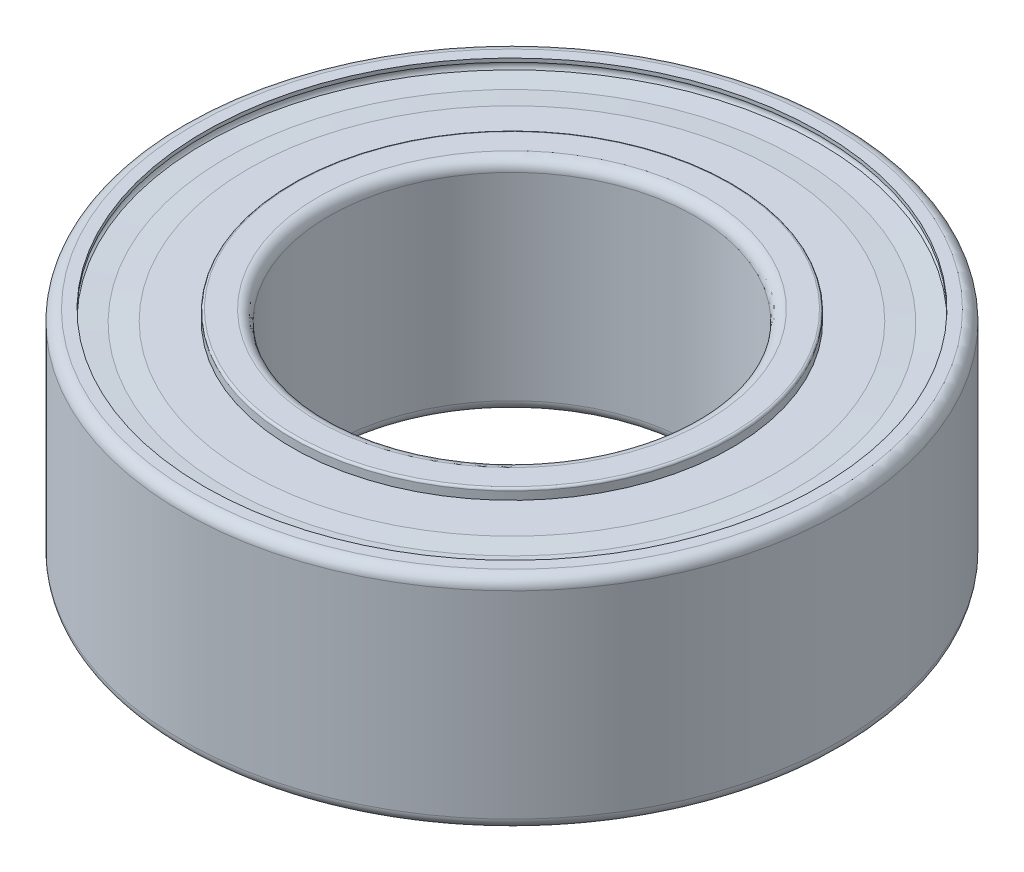
ISO-10303-21;
HEADER;
FILE_DESCRIPTION(('STEP AP214'),'2;1');
FILE_NAME('part.step','',(''),(''),'','','');
FILE_SCHEMA(('AUTOMOTIVE_DESIGN { 1 0 10303 214 1 1 1 1 }'));
ENDSEC;
DATA;
#1=APPLICATION_CONTEXT('core data for automotive mechanical design processes');
#2=APPLICATION_PROTOCOL_DEFINITION('international standard','automotive_design',2000,#1);
#3=PRODUCT_CONTEXT('',#1,'mechanical');
#4=PRODUCT('Part','Part','',(#3));
#5=PRODUCT_RELATED_PRODUCT_CATEGORY('part','',(#4));
#6=PRODUCT_DEFINITION_FORMATION('','',#4);
#7=PRODUCT_DEFINITION_CONTEXT('part definition',#1,'design');
#8=PRODUCT_DEFINITION('design','',#6,#7);
#9=PRODUCT_DEFINITION_SHAPE('','',#8);
#10=(LENGTH_UNIT() NAMED_UNIT(*) SI_UNIT(.MILLI.,.METRE.));
#11=(NAMED_UNIT(*) PLANE_ANGLE_UNIT() SI_UNIT($,.RADIAN.));
#12=(NAMED_UNIT(*) SI_UNIT($,.STERADIAN.) SOLID_ANGLE_UNIT());
#13=UNCERTAINTY_MEASURE_WITH_UNIT(LENGTH_MEASURE(1.E-05),#10,'distance_accuracy_value','');
#14=(GEOMETRIC_REPRESENTATION_CONTEXT(3) GLOBAL_UNCERTAINTY_ASSIGNED_CONTEXT((#13)) GLOBAL_UNIT_ASSIGNED_CONTEXT((#10,
#11,#12)) REPRESENTATION_CONTEXT('',''));
#15=CARTESIAN_POINT('',(0.,0.,0.));
#16=DIRECTION('',(0.,0.,1.));
#17=DIRECTION('',(1.,0.,0.));
#18=AXIS2_PLACEMENT_3D('',#15,#16,#17);
#19=CARTESIAN_POINT('',(2.43951839509362,0.,-2.43951839509356));
#20=DIRECTION('',(0.,1.,0.));
#21=DIRECTION('',(0.707106781186556,0.,-0.707106781186539));
#22=AXIS2_PLACEMENT_3D('',#19,#20,#21);
#23=SPHERICAL_SURFACE('',#22,0.6);
#24=CARTESIAN_POINT('',(2.43951839509362,0.599999999999998,-2.43951839509356));
#25=VERTEX_POINT('',#24);
#26=VERTEX_LOOP('',#25);
#27=FACE_BOUND('',#26,.T.);
#28=ADVANCED_FACE('F38',(#27),#23,.T.);
#29=CLOSED_SHELL('',(#28));
#30=MANIFOLD_SOLID_BREP('B2',#29);
#31=CARTESIAN_POINT('',(0.,0.,-3.45));
#32=DIRECTION('',(0.,1.,0.));
#33=DIRECTION('',(0.,0.,-1.));
#34=AXIS2_PLACEMENT_3D('',#31,#32,#33);
#35=SPHERICAL_SURFACE('',#34,0.6);
#36=CARTESIAN_POINT('',(0.,0.599999999999998,-3.45));
#37=VERTEX_POINT('',#36);
#38=VERTEX_LOOP('',#37);
#39=FACE_BOUND('',#38,.T.);
#40=ADVANCED_FACE('F69',(#39),#35,.T.);
#41=CLOSED_SHELL('',(#40));
#42=MANIFOLD_SOLID_BREP('B6',#41);
#43=CARTESIAN_POINT('',(-2.43951839509357,0.,-2.43951839509361));
#44=DIRECTION('',(0.,1.,0.));
#45=DIRECTION('',(-0.707106781186541,0.,-0.707106781186554));
#46=AXIS2_PLACEMENT_3D('',#43,#44,#45);
#47=SPHERICAL_SURFACE('',#46,0.6);
#48=CARTESIAN_POINT('',(-2.43951839509357,0.599999999999998,-2.43951839509361));
#49=VERTEX_POINT('',#48);
#50=VERTEX_LOOP('',#49);
#51=FACE_BOUND('',#50,.T.);
#52=ADVANCED_FACE('F100',(#51),#47,.T.);
#53=CLOSED_SHELL('',(#52));
#54=MANIFOLD_SOLID_BREP('B34',#53);
#55=CARTESIAN_POINT('',(-3.45,0.,0.));
#56=DIRECTION('',(0.,1.,0.));
#57=DIRECTION('',(-1.,0.,0.));
#58=AXIS2_PLACEMENT_3D('',#55,#56,#57);
#59=SPHERICAL_SURFACE('',#58,0.6);
#60=CARTESIAN_POINT('',(-3.45,0.599999999999998,0.));
#61=VERTEX_POINT('',#60);
#62=VERTEX_LOOP('',#61);
#63=FACE_BOUND('',#62,.T.);
#64=ADVANCED_FACE('F131',(#63),#59,.T.);
#65=CLOSED_SHELL('',(#64));
#66=MANIFOLD_SOLID_BREP('B65',#65);
#67=CARTESIAN_POINT('',(-2.4395183950936,0.,2.43951839509358));
#68=DIRECTION('',(0.,1.,0.));
#69=DIRECTION('',(-0.707106781186551,0.,0.707106781186544));
#70=AXIS2_PLACEMENT_3D('',#67,#68,#69);
#71=SPHERICAL_SURFACE('',#70,0.6);
#72=CARTESIAN_POINT('',(-2.4395183950936,0.599999999999998,2.43951839509358));
#73=VERTEX_POINT('',#72);
#74=VERTEX_LOOP('',#73);
#75=FACE_BOUND('',#74,.T.);
#76=ADVANCED_FACE('F162',(#75),#71,.T.);
#77=CLOSED_SHELL('',(#76));
#78=MANIFOLD_SOLID_BREP('B96',#77);
#79=CARTESIAN_POINT('',(0.,0.,3.45));
#80=DIRECTION('',(0.,1.,0.));
#81=DIRECTION('',(0.,0.,1.));
#82=AXIS2_PLACEMENT_3D('',#79,#80,#81);
#83=SPHERICAL_SURFACE('',#82,0.6);
#84=CARTESIAN_POINT('',(0.,0.599999999999998,3.45));
#85=VERTEX_POINT('',#84);
#86=VERTEX_LOOP('',#85);
#87=FACE_BOUND('',#86,.T.);
#88=ADVANCED_FACE('F193',(#87),#83,.T.);
#89=CLOSED_SHELL('',(#88));
#90=MANIFOLD_SOLID_BREP('B127',#89);
#91=CARTESIAN_POINT('',(2.43951839509359,0.,2.43951839509359));
#92=DIRECTION('',(0.,1.,0.));
#93=DIRECTION('',(0.707106781186546,0.,0.707106781186549));
#94=AXIS2_PLACEMENT_3D('',#91,#92,#93);
#95=SPHERICAL_SURFACE('',#94,0.6);
#96=CARTESIAN_POINT('',(2.43951839509359,0.599999999999998,2.43951839509359));
#97=VERTEX_POINT('',#96);
#98=VERTEX_LOOP('',#97);
#99=FACE_BOUND('',#98,.T.);
#100=ADVANCED_FACE('F224',(#99),#95,.T.);
#101=CLOSED_SHELL('',(#100));
#102=MANIFOLD_SOLID_BREP('B158',#101);
#103=CARTESIAN_POINT('',(3.45,0.,0.));
#104=DIRECTION('',(0.,1.,0.));
#105=DIRECTION('',(1.,0.,0.));
#106=AXIS2_PLACEMENT_3D('',#103,#104,#105);
#107=SPHERICAL_SURFACE('',#106,0.6);
#108=CARTESIAN_POINT('',(3.45,0.599999999999998,0.));
#109=VERTEX_POINT('',#108);
#110=VERTEX_LOOP('',#109);
#111=FACE_BOUND('',#110,.T.);
#112=ADVANCED_FACE('F257',(#111),#107,.T.);
#113=CLOSED_SHELL('',(#112));
#114=MANIFOLD_SOLID_BREP('B189',#113);
#115=CARTESIAN_POINT('',(3.9,1.27,0.));
#116=DIRECTION('',(0.,-1.,0.));
#117=DIRECTION('',(0.,0.,-1.));
#118=AXIS2_PLACEMENT_3D('',#115,#116,#117);
#119=PLANE('',#118);
#120=CARTESIAN_POINT('',(0.,1.27,0.));
#121=DIRECTION('',(0.,-1.,0.));
#122=DIRECTION('',(0.,0.,-1.));
#123=AXIS2_PLACEMENT_3D('',#120,#121,#122);
#124=CIRCLE('',#123,3.9);
#125=CARTESIAN_POINT('',(0.,1.27,-3.9));
#126=VERTEX_POINT('',#125);
#127=EDGE_CURVE('E256',#126,#126,#124,.T.);
#128=ORIENTED_EDGE('',*,*,#127,.T.);
#129=EDGE_LOOP('',(#128));
#130=FACE_BOUND('',#129,.T.);
#131=CARTESIAN_POINT('',(0.,1.27,0.));
#132=DIRECTION('',(0.,-1.,0.));
#133=DIRECTION('',(0.,0.,-1.));
#134=AXIS2_PLACEMENT_3D('',#131,#132,#133);
#135=CIRCLE('',#134,3.6);
#136=CARTESIAN_POINT('',(0.,1.27,-3.6));
#137=VERTEX_POINT('',#136);
#138=EDGE_CURVE('E359',#137,#137,#135,.T.);
#139=ORIENTED_EDGE('',*,*,#138,.F.);
#140=EDGE_LOOP('',(#139));
#141=FACE_BOUND('',#140,.T.);
#142=ADVANCED_FACE('F277',(#130,#141),#119,.T.);
#143=CARTESIAN_POINT('',(0.,1.27,0.));
#144=DIRECTION('',(0.,1.,0.));
#145=DIRECTION('',(0.,0.,1.));
#146=AXIS2_PLACEMENT_3D('',#143,#144,#145);
#147=CONICAL_SURFACE('',#146,3.9,1.43824479449822);
#148=CARTESIAN_POINT('',(0.,1.31,0.));
#149=DIRECTION('',(0.,-1.,0.));
#150=DIRECTION('',(0.,0.,-1.));
#151=AXIS2_PLACEMENT_3D('',#148,#149,#150);
#152=CIRCLE('',#151,4.2);
#153=CARTESIAN_POINT('',(0.,1.31,-4.2));
#154=VERTEX_POINT('',#153);
#155=EDGE_CURVE('E283',#154,#154,#152,.T.);
#156=ORIENTED_EDGE('',*,*,#155,.T.);
#157=EDGE_LOOP('',(#156));
#158=FACE_BOUND('',#157,.T.);
#159=ORIENTED_EDGE('',*,*,#127,.F.);
#160=EDGE_LOOP('',(#159));
#161=FACE_BOUND('',#160,.T.);
#162=ADVANCED_FACE('F367',(#158,#161),#147,.T.);
#163=CARTESIAN_POINT('',(0.,0.,0.));
#164=DIRECTION('',(0.,-1.,0.));
#165=DIRECTION('',(0.,0.,-1.));
#166=AXIS2_PLACEMENT_3D('',#163,#164,#165);
#167=CYLINDRICAL_SURFACE('',#166,4.2);
#168=CARTESIAN_POINT('',(0.,1.36,0.));
#169=DIRECTION('',(0.,-1.,0.));
#170=DIRECTION('',(0.,0.,-1.));
#171=AXIS2_PLACEMENT_3D('',#168,#169,#170);
#172=CIRCLE('',#171,4.2);
#173=CARTESIAN_POINT('',(0.,1.36,-4.2));
#174=VERTEX_POINT('',#173);
#175=EDGE_CURVE('E287',#174,#174,#172,.T.);
#176=ORIENTED_EDGE('',*,*,#175,.T.);
#177=EDGE_LOOP('',(#176));
#178=FACE_BOUND('',#177,.T.);
#179=ORIENTED_EDGE('',*,*,#155,.F.);
#180=EDGE_LOOP('',(#179));
#181=FACE_BOUND('',#180,.T.);
#182=ADVANCED_FACE('F371',(#178,#181),#167,.T.);
#183=CARTESIAN_POINT('',(0.,1.36,0.));
#184=DIRECTION('',(0.,1.,0.));
#185=DIRECTION('',(0.,0.,1.));
#186=AXIS2_PLACEMENT_3D('',#183,#184,#185);
#187=CONICAL_SURFACE('',#186,4.2,1.50422816301907);
#188=CARTESIAN_POINT('',(0.,1.34,0.));
#189=DIRECTION('',(0.,-1.,0.));
#190=DIRECTION('',(0.,0.,-1.));
#191=AXIS2_PLACEMENT_3D('',#188,#189,#190);
#192=CIRCLE('',#191,3.9);
#193=CARTESIAN_POINT('',(0.,1.34,-3.9));
#194=VERTEX_POINT('',#193);
#195=EDGE_CURVE('E291',#194,#194,#192,.T.);
#196=ORIENTED_EDGE('',*,*,#195,.T.);
#197=EDGE_LOOP('',(#196));
#198=FACE_BOUND('',#197,.T.);
#199=ORIENTED_EDGE('',*,*,#175,.F.);
#200=EDGE_LOOP('',(#199));
#201=FACE_BOUND('',#200,.T.);
#202=ADVANCED_FACE('F375',(#198,#201),#187,.F.);
#203=CARTESIAN_POINT('',(0.,1.34,0.));
#204=DIRECTION('',(0.,-1.,0.));
#205=DIRECTION('',(0.,0.,-1.));
#206=AXIS2_PLACEMENT_3D('',#203,#204,#205);
#207=CONICAL_SURFACE('',#206,3.9,1.50422816301907);
#208=CARTESIAN_POINT('',(0.,1.36,0.));
#209=DIRECTION('',(0.,-1.,0.));
#210=DIRECTION('',(0.,0.,-1.));
#211=AXIS2_PLACEMENT_3D('',#208,#209,#210);
#212=CIRCLE('',#211,3.6);
#213=CARTESIAN_POINT('',(0.,1.36,-3.6));
#214=VERTEX_POINT('',#213);
#215=EDGE_CURVE('E296',#214,#214,#212,.T.);
#216=ORIENTED_EDGE('',*,*,#215,.T.);
#217=EDGE_LOOP('',(#216));
#218=FACE_BOUND('',#217,.T.);
#219=ORIENTED_EDGE('',*,*,#195,.F.);
#220=EDGE_LOOP('',(#219));
#221=FACE_BOUND('',#220,.T.);
#222=ADVANCED_FACE('F382',(#218,#221),#207,.T.);
#223=CARTESIAN_POINT('',(3.,1.36,0.));
#224=DIRECTION('',(0.,1.,0.));
#225=DIRECTION('',(0.,0.,1.));
#226=AXIS2_PLACEMENT_3D('',#223,#224,#225);
#227=PLANE('',#226);
#228=CARTESIAN_POINT('',(0.,1.36,0.));
#229=DIRECTION('',(0.,-1.,0.));
#230=DIRECTION('',(0.,0.,-1.));
#231=AXIS2_PLACEMENT_3D('',#228,#229,#230);
#232=CIRCLE('',#231,3.);
#233=CARTESIAN_POINT('',(0.,1.36,-3.));
#234=VERTEX_POINT('',#233);
#235=EDGE_CURVE('E299',#234,#234,#232,.T.);
#236=ORIENTED_EDGE('',*,*,#235,.T.);
#237=EDGE_LOOP('',(#236));
#238=FACE_BOUND('',#237,.T.);
#239=ORIENTED_EDGE('',*,*,#215,.F.);
#240=EDGE_LOOP('',(#239));
#241=FACE_BOUND('',#240,.T.);
#242=ADVANCED_FACE('F386',(#238,#241),#227,.T.);
#243=CARTESIAN_POINT('',(0.,0.,0.));
#244=DIRECTION('',(0.,-1.,0.));
#245=DIRECTION('',(0.,0.,-1.));
#246=AXIS2_PLACEMENT_3D('',#243,#244,#245);
#247=CYLINDRICAL_SURFACE('',#246,3.);
#248=CARTESIAN_POINT('',(0.,1.47,0.));
#249=DIRECTION('',(0.,-1.,0.));
#250=DIRECTION('',(0.,0.,-1.));
#251=AXIS2_PLACEMENT_3D('',#248,#249,#250);
#252=CIRCLE('',#251,3.);
#253=CARTESIAN_POINT('',(0.,1.47,-3.));
#254=VERTEX_POINT('',#253);
#255=EDGE_CURVE('E302',#254,#254,#252,.T.);
#256=ORIENTED_EDGE('',*,*,#255,.T.);
#257=EDGE_LOOP('',(#256));
#258=FACE_BOUND('',#257,.T.);
#259=ORIENTED_EDGE('',*,*,#235,.F.);
#260=EDGE_LOOP('',(#259));
#261=FACE_BOUND('',#260,.T.);
#262=ADVANCED_FACE('F390',(#258,#261),#247,.T.);
#263=CARTESIAN_POINT('',(0.,1.47,0.));
#264=DIRECTION('',(0.,-1.,0.));
#265=DIRECTION('',(0.,0.,-1.));
#266=AXIS2_PLACEMENT_3D('',#263,#264,#265);
#267=TOROIDAL_SURFACE('',#266,2.97,0.0300000000000003);
#268=CARTESIAN_POINT('',(0.,1.5,0.));
#269=DIRECTION('',(0.,-1.,0.));
#270=DIRECTION('',(0.,0.,-1.));
#271=AXIS2_PLACEMENT_3D('',#268,#269,#270);
#272=CIRCLE('',#271,2.97);
#273=CARTESIAN_POINT('',(0.,1.5,-2.97));
#274=VERTEX_POINT('',#273);
#275=EDGE_CURVE('E305',#274,#274,#272,.T.);
#276=ORIENTED_EDGE('',*,*,#275,.T.);
#277=EDGE_LOOP('',(#276));
#278=FACE_BOUND('',#277,.T.);
#279=ORIENTED_EDGE('',*,*,#255,.F.);
#280=EDGE_LOOP('',(#279));
#281=FACE_BOUND('',#280,.T.);
#282=ADVANCED_FACE('F394',(#278,#281),#267,.T.);
#283=CARTESIAN_POINT('',(2.65,1.5,0.));
#284=DIRECTION('',(0.,1.,0.));
#285=DIRECTION('',(0.,0.,1.));
#286=AXIS2_PLACEMENT_3D('',#283,#284,#285);
#287=PLANE('',#286);
#288=CARTESIAN_POINT('',(0.,1.5,0.));
#289=DIRECTION('',(0.,-1.,0.));
#290=DIRECTION('',(0.,0.,-1.));
#291=AXIS2_PLACEMENT_3D('',#288,#289,#290);
#292=CIRCLE('',#291,2.65);
#293=CARTESIAN_POINT('',(0.,1.5,-2.65));
#294=VERTEX_POINT('',#293);
#295=EDGE_CURVE('E308',#294,#294,#292,.T.);
#296=ORIENTED_EDGE('',*,*,#295,.T.);
#297=EDGE_LOOP('',(#296));
#298=FACE_BOUND('',#297,.T.);
#299=ORIENTED_EDGE('',*,*,#275,.F.);
#300=EDGE_LOOP('',(#299));
#301=FACE_BOUND('',#300,.T.);
#302=ADVANCED_FACE('F398',(#298,#301),#287,.T.);
#303=CARTESIAN_POINT('',(0.,1.35,0.));
#304=DIRECTION('',(0.,-1.,0.));
#305=DIRECTION('',(0.,0.,-1.));
#306=AXIS2_PLACEMENT_3D('',#303,#304,#305);
#307=TOROIDAL_SURFACE('',#306,2.65,0.15);
#308=CARTESIAN_POINT('',(0.,1.35,0.));
#309=DIRECTION('',(0.,-1.,0.));
#310=DIRECTION('',(0.,0.,-1.));
#311=AXIS2_PLACEMENT_3D('',#308,#309,#310);
#312=CIRCLE('',#311,2.5);
#313=CARTESIAN_POINT('',(0.,1.35,-2.5));
#314=VERTEX_POINT('',#313);
#315=EDGE_CURVE('E311',#314,#314,#312,.T.);
#316=ORIENTED_EDGE('',*,*,#315,.T.);
#317=EDGE_LOOP('',(#316));
#318=FACE_BOUND('',#317,.T.);
#319=ORIENTED_EDGE('',*,*,#295,.F.);
#320=EDGE_LOOP('',(#319));
#321=FACE_BOUND('',#320,.T.);
#322=ADVANCED_FACE('F402',(#318,#321),#307,.T.);
#323=CARTESIAN_POINT('',(0.,0.,0.));
#324=DIRECTION('',(0.,-1.,0.));
#325=DIRECTION('',(0.,0.,-1.));
#326=AXIS2_PLACEMENT_3D('',#323,#324,#325);
#327=CYLINDRICAL_SURFACE('',#326,2.5);
#328=CARTESIAN_POINT('',(0.,-1.35,0.));
#329=DIRECTION('',(0.,-1.,0.));
#330=DIRECTION('',(0.,0.,-1.));
#331=AXIS2_PLACEMENT_3D('',#328,#329,#330);
#332=CIRCLE('',#331,2.5);
#333=CARTESIAN_POINT('',(0.,-1.35,-2.5));
#334=VERTEX_POINT('',#333);
#335=EDGE_CURVE('E314',#334,#334,#332,.T.);
#336=ORIENTED_EDGE('',*,*,#335,.T.);
#337=EDGE_LOOP('',(#336));
#338=FACE_BOUND('',#337,.T.);
#339=ORIENTED_EDGE('',*,*,#315,.F.);
#340=EDGE_LOOP('',(#339));
#341=FACE_BOUND('',#340,.T.);
#342=ADVANCED_FACE('F406',(#338,#341),#327,.F.);
#343=CARTESIAN_POINT('',(0.,-1.35,0.));
#344=DIRECTION('',(0.,-1.,0.));
#345=DIRECTION('',(0.,0.,-1.));
#346=AXIS2_PLACEMENT_3D('',#343,#344,#345);
#347=TOROIDAL_SURFACE('',#346,2.65,0.15);
#348=CARTESIAN_POINT('',(0.,-1.5,0.));
#349=DIRECTION('',(0.,-1.,0.));
#350=DIRECTION('',(0.,0.,-1.));
#351=AXIS2_PLACEMENT_3D('',#348,#349,#350);
#352=CIRCLE('',#351,2.65);
#353=CARTESIAN_POINT('',(0.,-1.5,-2.65));
#354=VERTEX_POINT('',#353);
#355=EDGE_CURVE('E317',#354,#354,#352,.T.);
#356=ORIENTED_EDGE('',*,*,#355,.T.);
#357=EDGE_LOOP('',(#356));
#358=FACE_BOUND('',#357,.T.);
#359=ORIENTED_EDGE('',*,*,#335,.F.);
#360=EDGE_LOOP('',(#359));
#361=FACE_BOUND('',#360,.T.);
#362=ADVANCED_FACE('F410',(#358,#361),#347,.T.);
#363=CARTESIAN_POINT('',(2.65,-1.5,0.));
#364=DIRECTION('',(0.,-1.,0.));
#365=DIRECTION('',(0.,0.,-1.));
#366=AXIS2_PLACEMENT_3D('',#363,#364,#365);
#367=PLANE('',#366);
#368=CARTESIAN_POINT('',(0.,-1.5,0.));
#369=DIRECTION('',(0.,-1.,0.));
#370=DIRECTION('',(0.,0.,-1.));
#371=AXIS2_PLACEMENT_3D('',#368,#369,#370);
#372=CIRCLE('',#371,2.97);
#373=CARTESIAN_POINT('',(0.,-1.5,-2.97));
#374=VERTEX_POINT('',#373);
#375=EDGE_CURVE('E320',#374,#374,#372,.T.);
#376=ORIENTED_EDGE('',*,*,#375,.T.);
#377=EDGE_LOOP('',(#376));
#378=FACE_BOUND('',#377,.T.);
#379=ORIENTED_EDGE('',*,*,#355,.F.);
#380=EDGE_LOOP('',(#379));
#381=FACE_BOUND('',#380,.T.);
#382=ADVANCED_FACE('F414',(#378,#381),#367,.T.);
#383=CARTESIAN_POINT('',(0.,-1.47,0.));
#384=DIRECTION('',(0.,-1.,0.));
#385=DIRECTION('',(0.,0.,-1.));
#386=AXIS2_PLACEMENT_3D('',#383,#384,#385);
#387=TOROIDAL_SURFACE('',#386,2.97,0.0299999999999986);
#388=CARTESIAN_POINT('',(0.,-1.47,0.));
#389=DIRECTION('',(0.,-1.,0.));
#390=DIRECTION('',(0.,0.,-1.));
#391=AXIS2_PLACEMENT_3D('',#388,#389,#390);
#392=CIRCLE('',#391,3.);
#393=CARTESIAN_POINT('',(0.,-1.47,-3.));
#394=VERTEX_POINT('',#393);
#395=EDGE_CURVE('E323',#394,#394,#392,.T.);
#396=ORIENTED_EDGE('',*,*,#395,.T.);
#397=EDGE_LOOP('',(#396));
#398=FACE_BOUND('',#397,.T.);
#399=ORIENTED_EDGE('',*,*,#375,.F.);
#400=EDGE_LOOP('',(#399));
#401=FACE_BOUND('',#400,.T.);
#402=ADVANCED_FACE('F418',(#398,#401),#387,.T.);
#403=CARTESIAN_POINT('',(0.,0.,0.));
#404=DIRECTION('',(0.,-1.,0.));
#405=DIRECTION('',(0.,0.,-1.));
#406=AXIS2_PLACEMENT_3D('',#403,#404,#405);
#407=CYLINDRICAL_SURFACE('',#406,3.);
#408=CARTESIAN_POINT('',(0.,-1.36,0.));
#409=DIRECTION('',(0.,-1.,0.));
#410=DIRECTION('',(0.,0.,-1.));
#411=AXIS2_PLACEMENT_3D('',#408,#409,#410);
#412=CIRCLE('',#411,3.);
#413=CARTESIAN_POINT('',(0.,-1.36,-3.));
#414=VERTEX_POINT('',#413);
#415=EDGE_CURVE('E326',#414,#414,#412,.T.);
#416=ORIENTED_EDGE('',*,*,#415,.T.);
#417=EDGE_LOOP('',(#416));
#418=FACE_BOUND('',#417,.T.);
#419=ORIENTED_EDGE('',*,*,#395,.F.);
#420=EDGE_LOOP('',(#419));
#421=FACE_BOUND('',#420,.T.);
#422=ADVANCED_FACE('F422',(#418,#421),#407,.T.);
#423=CARTESIAN_POINT('',(3.,-1.36,0.));
#424=DIRECTION('',(0.,-1.,0.));
#425=DIRECTION('',(0.,0.,-1.));
#426=AXIS2_PLACEMENT_3D('',#423,#424,#425);
#427=PLANE('',#426);
#428=CARTESIAN_POINT('',(0.,-1.36,0.));
#429=DIRECTION('',(0.,-1.,0.));
#430=DIRECTION('',(0.,0.,-1.));
#431=AXIS2_PLACEMENT_3D('',#428,#429,#430);
#432=CIRCLE('',#431,3.6);
#433=CARTESIAN_POINT('',(0.,-1.36,-3.6));
#434=VERTEX_POINT('',#433);
#435=EDGE_CURVE('E329',#434,#434,#432,.T.);
#436=ORIENTED_EDGE('',*,*,#435,.T.);
#437=EDGE_LOOP('',(#436));
#438=FACE_BOUND('',#437,.T.);
#439=ORIENTED_EDGE('',*,*,#415,.F.);
#440=EDGE_LOOP('',(#439));
#441=FACE_BOUND('',#440,.T.);
#442=ADVANCED_FACE('F426',(#438,#441),#427,.T.);
#443=CARTESIAN_POINT('',(0.,-1.36,0.));
#444=DIRECTION('',(0.,1.,0.));
#445=DIRECTION('',(0.,0.,1.));
#446=AXIS2_PLACEMENT_3D('',#443,#444,#445);
#447=CONICAL_SURFACE('',#446,3.6,1.39793572000776);
#448=CARTESIAN_POINT('',(0.,-1.30828515273278,0.));
#449=DIRECTION('',(0.,-1.,0.));
#450=DIRECTION('',(0.,0.,-1.));
#451=AXIS2_PLACEMENT_3D('',#448,#449,#450);
#452=CIRCLE('',#451,3.89618503434868);
#453=CARTESIAN_POINT('',(0.,-1.30828515273278,-3.89618503434868));
#454=VERTEX_POINT('',#453);
#455=EDGE_CURVE('E332',#454,#454,#452,.T.);
#456=ORIENTED_EDGE('',*,*,#455,.T.);
#457=EDGE_LOOP('',(#456));
#458=FACE_BOUND('',#457,.T.);
#459=ORIENTED_EDGE('',*,*,#435,.F.);
#460=EDGE_LOOP('',(#459));
#461=FACE_BOUND('',#460,.T.);
#462=ADVANCED_FACE('F430',(#458,#461),#447,.T.);
#463=CARTESIAN_POINT('',(0.,-1.30828515273278,0.));
#464=DIRECTION('',(0.,-1.,0.));
#465=DIRECTION('',(0.,0.,-1.));
#466=AXIS2_PLACEMENT_3D('',#463,#464,#465);
#467=CONICAL_SURFACE('',#466,3.89618503434868,1.39793572000775);
#468=CARTESIAN_POINT('',(0.,-1.36,0.));
#469=DIRECTION('',(0.,-1.,0.));
#470=DIRECTION('',(0.,0.,-1.));
#471=AXIS2_PLACEMENT_3D('',#468,#469,#470);
#472=CIRCLE('',#471,4.19237006869736);
#473=CARTESIAN_POINT('',(0.,-1.36,-4.19237006869736));
#474=VERTEX_POINT('',#473);
#475=EDGE_CURVE('E335',#474,#474,#472,.T.);
#476=ORIENTED_EDGE('',*,*,#475,.T.);
#477=EDGE_LOOP('',(#476));
#478=FACE_BOUND('',#477,.T.);
#479=ORIENTED_EDGE('',*,*,#455,.F.);
#480=EDGE_LOOP('',(#479));
#481=FACE_BOUND('',#480,.T.);
#482=ADVANCED_FACE('F434',(#478,#481),#467,.F.);
#483=CARTESIAN_POINT('',(0.,0.,0.));
#484=DIRECTION('',(0.,-1.,0.));
#485=DIRECTION('',(0.,0.,-1.));
#486=AXIS2_PLACEMENT_3D('',#483,#484,#485);
#487=CYLINDRICAL_SURFACE('',#486,4.19237006869736);
#488=CARTESIAN_POINT('',(0.,-1.31,0.));
#489=DIRECTION('',(0.,-1.,0.));
#490=DIRECTION('',(0.,0.,-1.));
#491=AXIS2_PLACEMENT_3D('',#488,#489,#490);
#492=CIRCLE('',#491,4.19237006869736);
#493=CARTESIAN_POINT('',(0.,-1.31,-4.19237006869736));
#494=VERTEX_POINT('',#493);
#495=EDGE_CURVE('E338',#494,#494,#492,.T.);
#496=ORIENTED_EDGE('',*,*,#495,.T.);
#497=EDGE_LOOP('',(#496));
#498=FACE_BOUND('',#497,.T.);
#499=ORIENTED_EDGE('',*,*,#475,.F.);
#500=EDGE_LOOP('',(#499));
#501=FACE_BOUND('',#500,.T.);
#502=ADVANCED_FACE('F438',(#498,#501),#487,.T.);
#503=CARTESIAN_POINT('',(0.,-1.31,0.));
#504=DIRECTION('',(0.,-1.,0.));
#505=DIRECTION('',(0.,0.,-1.));
#506=AXIS2_PLACEMENT_3D('',#503,#504,#505);
#507=CONICAL_SURFACE('',#506,4.19237006869736,1.34397129289869);
#508=CARTESIAN_POINT('',(0.,-1.24193744191795,0.));
#509=DIRECTION('',(0.,-1.,0.));
#510=DIRECTION('',(0.,0.,-1.));
#511=AXIS2_PLACEMENT_3D('',#508,#509,#510);
#512=CIRCLE('',#511,3.89746756245618);
#513=CARTESIAN_POINT('',(0.,-1.24193744191795,-3.89746756245618));
#514=VERTEX_POINT('',#513);
#515=EDGE_CURVE('E341',#514,#514,#512,.T.);
#516=ORIENTED_EDGE('',*,*,#515,.T.);
#517=EDGE_LOOP('',(#516));
#518=FACE_BOUND('',#517,.T.);
#519=ORIENTED_EDGE('',*,*,#495,.F.);
#520=EDGE_LOOP('',(#519));
#521=FACE_BOUND('',#520,.T.);
#522=ADVANCED_FACE('F442',(#518,#521),#507,.T.);
#523=CARTESIAN_POINT('',(3.89746756245618,-1.24193744191795,0.));
#524=DIRECTION('',(0.,1.,0.));
#525=DIRECTION('',(0.,0.,1.));
#526=AXIS2_PLACEMENT_3D('',#523,#524,#525);
#527=PLANE('',#526);
#528=CARTESIAN_POINT('',(0.,-1.24193744191795,0.));
#529=DIRECTION('',(0.,-1.,0.));
#530=DIRECTION('',(0.,0.,-1.));
#531=AXIS2_PLACEMENT_3D('',#528,#529,#530);
#532=CIRCLE('',#531,3.59746756245618);
#533=CARTESIAN_POINT('',(0.,-1.24193744191795,-3.59746756245618));
#534=VERTEX_POINT('',#533);
#535=EDGE_CURVE('E344',#534,#534,#532,.T.);
#536=ORIENTED_EDGE('',*,*,#535,.T.);
#537=EDGE_LOOP('',(#536));
#538=FACE_BOUND('',#537,.T.);
#539=ORIENTED_EDGE('',*,*,#515,.F.);
#540=EDGE_LOOP('',(#539));
#541=FACE_BOUND('',#540,.T.);
#542=ADVANCED_FACE('F446',(#538,#541),#527,.T.);
#543=CARTESIAN_POINT('',(0.,-1.24193744191795,0.));
#544=DIRECTION('',(0.,1.,0.));
#545=DIRECTION('',(0.,0.,1.));
#546=AXIS2_PLACEMENT_3D('',#543,#544,#545);
#547=CONICAL_SURFACE('',#546,3.59746756245618,1.45736689783465);
#548=CARTESIAN_POINT('',(0.,-1.31,0.));
#549=DIRECTION('',(0.,-1.,0.));
#550=DIRECTION('',(0.,0.,-1.));
#551=AXIS2_PLACEMENT_3D('',#548,#549,#550);
#552=CIRCLE('',#551,3.);
#553=CARTESIAN_POINT('',(0.,-1.31,-3.));
#554=VERTEX_POINT('',#553);
#555=EDGE_CURVE('E347',#554,#554,#552,.T.);
#556=ORIENTED_EDGE('',*,*,#555,.T.);
#557=EDGE_LOOP('',(#556));
#558=FACE_BOUND('',#557,.T.);
#559=ORIENTED_EDGE('',*,*,#535,.F.);
#560=EDGE_LOOP('',(#559));
#561=FACE_BOUND('',#560,.T.);
#562=ADVANCED_FACE('F450',(#558,#561),#547,.F.);
#563=CARTESIAN_POINT('',(0.,0.,0.));
#564=DIRECTION('',(0.,-1.,0.));
#565=DIRECTION('',(0.,0.,-1.));
#566=AXIS2_PLACEMENT_3D('',#563,#564,#565);
#567=CYLINDRICAL_SURFACE('',#566,3.);
#568=CARTESIAN_POINT('',(0.,-0.396862696659691,0.));
#569=DIRECTION('',(0.,-1.,0.));
#570=DIRECTION('',(0.,0.,-1.));
#571=AXIS2_PLACEMENT_3D('',#568,#569,#570);
#572=CIRCLE('',#571,3.);
#573=CARTESIAN_POINT('',(0.,-0.396862696659691,-3.));
#574=VERTEX_POINT('',#573);
#575=EDGE_CURVE('E350',#574,#574,#572,.T.);
#576=ORIENTED_EDGE('',*,*,#575,.T.);
#577=EDGE_LOOP('',(#576));
#578=FACE_BOUND('',#577,.T.);
#579=ORIENTED_EDGE('',*,*,#555,.F.);
#580=EDGE_LOOP('',(#579));
#581=FACE_BOUND('',#580,.T.);
#582=ADVANCED_FACE('F454',(#578,#581),#567,.T.);
#583=CARTESIAN_POINT('',(0.,0.,0.));
#584=DIRECTION('',(0.,-1.,0.));
#585=DIRECTION('',(0.,0.,-1.));
#586=AXIS2_PLACEMENT_3D('',#583,#584,#585);
#587=TOROIDAL_SURFACE('',#586,3.45,0.6);
#588=CARTESIAN_POINT('',(0.,0.396862696659687,0.));
#589=DIRECTION('',(0.,-1.,0.));
#590=DIRECTION('',(0.,0.,-1.));
#591=AXIS2_PLACEMENT_3D('',#588,#589,#590);
#592=CIRCLE('',#591,3.);
#593=CARTESIAN_POINT('',(0.,0.396862696659687,-3.));
#594=VERTEX_POINT('',#593);
#595=EDGE_CURVE('E353',#594,#594,#592,.T.);
#596=ORIENTED_EDGE('',*,*,#595,.T.);
#597=EDGE_LOOP('',(#596));
#598=FACE_BOUND('',#597,.T.);
#599=ORIENTED_EDGE('',*,*,#575,.F.);
#600=EDGE_LOOP('',(#599));
#601=FACE_BOUND('',#600,.T.);
#602=ADVANCED_FACE('F458',(#598,#601),#587,.F.);
#603=CARTESIAN_POINT('',(0.,0.,0.));
#604=DIRECTION('',(0.,-1.,0.));
#605=DIRECTION('',(0.,0.,-1.));
#606=AXIS2_PLACEMENT_3D('',#603,#604,#605);
#607=CYLINDRICAL_SURFACE('',#606,3.);
#608=CARTESIAN_POINT('',(0.,1.31,0.));
#609=DIRECTION('',(0.,-1.,0.));
#610=DIRECTION('',(0.,0.,-1.));
#611=AXIS2_PLACEMENT_3D('',#608,#609,#610);
#612=CIRCLE('',#611,3.);
#613=CARTESIAN_POINT('',(0.,1.31,-3.));
#614=VERTEX_POINT('',#613);
#615=EDGE_CURVE('E356',#614,#614,#612,.T.);
#616=ORIENTED_EDGE('',*,*,#615,.T.);
#617=EDGE_LOOP('',(#616));
#618=FACE_BOUND('',#617,.T.);
#619=ORIENTED_EDGE('',*,*,#595,.F.);
#620=EDGE_LOOP('',(#619));
#621=FACE_BOUND('',#620,.T.);
#622=ADVANCED_FACE('F462',(#618,#621),#607,.T.);
#623=CARTESIAN_POINT('',(0.,1.31,0.));
#624=DIRECTION('',(0.,-1.,0.));
#625=DIRECTION('',(0.,0.,-1.));
#626=AXIS2_PLACEMENT_3D('',#623,#624,#625);
#627=CONICAL_SURFACE('',#626,3.,1.50422816301907);
#628=ORIENTED_EDGE('',*,*,#138,.T.);
#629=EDGE_LOOP('',(#628));
#630=FACE_BOUND('',#629,.T.);
#631=ORIENTED_EDGE('',*,*,#615,.F.);
#632=EDGE_LOOP('',(#631));
#633=FACE_BOUND('',#632,.T.);
#634=ADVANCED_FACE('F363',(#630,#633),#627,.F.);
#635=CLOSED_SHELL('',(#142,#162,#182,#202,#222,#242,#262,#282,#302,#322,#342,#362,#382,#402,
#422,#442,#462,#482,#502,#522,#542,#562,#582,#602,#622,#634));
#636=MANIFOLD_SOLID_BREP('B220',#635);
#637=CARTESIAN_POINT('',(0.,0.,0.));
#638=DIRECTION('',(0.,-1.,0.));
#639=DIRECTION('',(0.,0.,-1.));
#640=AXIS2_PLACEMENT_3D('',#637,#638,#639);
#641=CYLINDRICAL_SURFACE('',#640,3.85);
#642=CARTESIAN_POINT('',(0.,-1.21721359549996,0.));
#643=DIRECTION('',(0.,-1.,0.));
#644=DIRECTION('',(0.,0.,-1.));
#645=AXIS2_PLACEMENT_3D('',#642,#643,#644);
#646=CIRCLE('',#645,3.85);
#647=CARTESIAN_POINT('',(0.,-1.21721359549996,-3.85));
#648=VERTEX_POINT('',#647);
#649=EDGE_CURVE('E715',#648,#648,#646,.T.);
#650=ORIENTED_EDGE('',*,*,#649,.T.);
#651=EDGE_LOOP('',(#650));
#652=FACE_BOUND('',#651,.T.);
#653=CARTESIAN_POINT('',(0.,-0.447213595499958,0.));
#654=DIRECTION('',(0.,-1.,0.));
#655=DIRECTION('',(0.,0.,-1.));
#656=AXIS2_PLACEMENT_3D('',#653,#654,#655);
#657=CIRCLE('',#656,3.85);
#658=CARTESIAN_POINT('',(0.,-0.447213595499958,-3.85));
#659=VERTEX_POINT('',#658);
#660=EDGE_CURVE('E276',#659,#659,#657,.T.);
#661=ORIENTED_EDGE('',*,*,#660,.F.);
#662=EDGE_LOOP('',(#661));
#663=FACE_BOUND('',#662,.T.);
#664=ADVANCED_FACE('F669',(#652,#663),#641,.F.);
#665=CARTESIAN_POINT('',(0.,0.,0.));
#666=DIRECTION('',(0.,-1.,0.));
#667=DIRECTION('',(0.,0.,-1.));
#668=AXIS2_PLACEMENT_3D('',#665,#666,#667);
#669=TOROIDAL_SURFACE('',#668,3.45,0.6);
#670=ORIENTED_EDGE('',*,*,#660,.T.);
#671=EDGE_LOOP('',(#670));
#672=FACE_BOUND('',#671,.T.);
#673=CARTESIAN_POINT('',(0.,0.447213595499955,0.));
#674=DIRECTION('',(0.,-1.,0.));
#675=DIRECTION('',(0.,0.,-1.));
#676=AXIS2_PLACEMENT_3D('',#673,#674,#675);
#677=CIRCLE('',#676,3.85);
#678=CARTESIAN_POINT('',(0.,0.447213595499955,-3.85));
#679=VERTEX_POINT('',#678);
#680=EDGE_CURVE('E675',#679,#679,#677,.T.);
#681=ORIENTED_EDGE('',*,*,#680,.F.);
#682=EDGE_LOOP('',(#681));
#683=FACE_BOUND('',#682,.T.);
#684=ADVANCED_FACE('F733',(#672,#683),#669,.F.);
#685=CARTESIAN_POINT('',(0.,0.,0.));
#686=DIRECTION('',(0.,-1.,0.));
#687=DIRECTION('',(0.,0.,-1.));
#688=AXIS2_PLACEMENT_3D('',#685,#686,#687);
#689=CYLINDRICAL_SURFACE('',#688,3.85);
#690=ORIENTED_EDGE('',*,*,#680,.T.);
#691=EDGE_LOOP('',(#690));
#692=FACE_BOUND('',#691,.T.);
#693=CARTESIAN_POINT('',(0.,1.21721359549995,0.));
#694=DIRECTION('',(0.,-1.,0.));
#695=DIRECTION('',(0.,0.,-1.));
#696=AXIS2_PLACEMENT_3D('',#693,#694,#695);
#697=CIRCLE('',#696,3.85);
#698=CARTESIAN_POINT('',(0.,1.21721359549995,-3.85));
#699=VERTEX_POINT('',#698);
#700=EDGE_CURVE('E679',#699,#699,#697,.T.);
#701=ORIENTED_EDGE('',*,*,#700,.F.);
#702=EDGE_LOOP('',(#701));
#703=FACE_BOUND('',#702,.T.);
#704=ADVANCED_FACE('F737',(#692,#703),#689,.F.);
#705=CARTESIAN_POINT('',(0.,1.27096999256116,0.));
#706=DIRECTION('',(0.,1.,0.));
#707=DIRECTION('',(0.,0.,1.));
#708=AXIS2_PLACEMENT_3D('',#705,#706,#707);
#709=CONICAL_SURFACE('',#708,4.21317792758515,1.42384660244088);
#710=ORIENTED_EDGE('',*,*,#700,.T.);
#711=EDGE_LOOP('',(#710));
#712=FACE_BOUND('',#711,.T.);
#713=CARTESIAN_POINT('',(0.,1.27096999256116,0.));
#714=DIRECTION('',(0.,-1.,0.));
#715=DIRECTION('',(0.,0.,-1.));
#716=AXIS2_PLACEMENT_3D('',#713,#714,#715);
#717=CIRCLE('',#716,4.21317792758515);
#718=CARTESIAN_POINT('',(0.,1.27096999256116,-4.21317792758515));
#719=VERTEX_POINT('',#718);
#720=EDGE_CURVE('E683',#719,#719,#717,.T.);
#721=ORIENTED_EDGE('',*,*,#720,.F.);
#722=EDGE_LOOP('',(#721));
#723=FACE_BOUND('',#722,.T.);
#724=ADVANCED_FACE('F741',(#712,#723),#709,.F.);
#725=CARTESIAN_POINT('',(0.,1.36,0.));
#726=DIRECTION('',(0.,-1.,0.));
#727=DIRECTION('',(0.,0.,-1.));
#728=AXIS2_PLACEMENT_3D('',#725,#726,#727);
#729=TOROIDAL_SURFACE('',#728,4.2,0.09);
#730=ORIENTED_EDGE('',*,*,#720,.T.);
#731=EDGE_LOOP('',(#730));
#732=FACE_BOUND('',#731,.T.);
#733=CARTESIAN_POINT('',(0.,1.45,0.));
#734=DIRECTION('',(0.,-1.,0.));
#735=DIRECTION('',(0.,0.,-1.));
#736=AXIS2_PLACEMENT_3D('',#733,#734,#735);
#737=CIRCLE('',#736,4.2);
#738=CARTESIAN_POINT('',(0.,1.45,-4.2));
#739=VERTEX_POINT('',#738);
#740=EDGE_CURVE('E688',#739,#739,#737,.T.);
#741=ORIENTED_EDGE('',*,*,#740,.F.);
#742=EDGE_LOOP('',(#741));
#743=FACE_BOUND('',#742,.T.);
#744=ADVANCED_FACE('F747',(#732,#743),#729,.F.);
#745=CARTESIAN_POINT('',(0.,0.,0.));
#746=DIRECTION('',(0.,-1.,0.));
#747=DIRECTION('',(0.,0.,-1.));
#748=AXIS2_PLACEMENT_3D('',#745,#746,#747);
#749=CYLINDRICAL_SURFACE('',#748,4.2);
#750=ORIENTED_EDGE('',*,*,#740,.T.);
#751=EDGE_LOOP('',(#750));
#752=FACE_BOUND('',#751,.T.);
#753=CARTESIAN_POINT('',(0.,1.5,0.));
#754=DIRECTION('',(0.,-1.,0.));
#755=DIRECTION('',(0.,0.,-1.));
#756=AXIS2_PLACEMENT_3D('',#753,#754,#755);
#757=CIRCLE('',#756,4.2);
#758=CARTESIAN_POINT('',(0.,1.5,-4.2));
#759=VERTEX_POINT('',#758);
#760=EDGE_CURVE('E691',#759,#759,#757,.T.);
#761=ORIENTED_EDGE('',*,*,#760,.F.);
#762=EDGE_LOOP('',(#761));
#763=FACE_BOUND('',#762,.T.);
#764=ADVANCED_FACE('F751',(#752,#763),#749,.F.);
#765=CARTESIAN_POINT('',(4.35,1.5,0.));
#766=DIRECTION('',(0.,1.,0.));
#767=DIRECTION('',(0.,0.,1.));
#768=AXIS2_PLACEMENT_3D('',#765,#766,#767);
#769=PLANE('',#768);
#770=ORIENTED_EDGE('',*,*,#760,.T.);
#771=EDGE_LOOP('',(#770));
#772=FACE_BOUND('',#771,.T.);
#773=CARTESIAN_POINT('',(0.,1.5,0.));
#774=DIRECTION('',(0.,-1.,0.));
#775=DIRECTION('',(0.,0.,-1.));
#776=AXIS2_PLACEMENT_3D('',#773,#774,#775);
#777=CIRCLE('',#776,4.35);
#778=CARTESIAN_POINT('',(0.,1.5,-4.35));
#779=VERTEX_POINT('',#778);
#780=EDGE_CURVE('E694',#779,#779,#777,.T.);
#781=ORIENTED_EDGE('',*,*,#780,.F.);
#782=EDGE_LOOP('',(#781));
#783=FACE_BOUND('',#782,.T.);
#784=ADVANCED_FACE('F755',(#772,#783),#769,.T.);
#785=CARTESIAN_POINT('',(0.,1.35,0.));
#786=DIRECTION('',(0.,-1.,0.));
#787=DIRECTION('',(0.,0.,-1.));
#788=AXIS2_PLACEMENT_3D('',#785,#786,#787);
#789=TOROIDAL_SURFACE('',#788,4.35,0.15);
#790=ORIENTED_EDGE('',*,*,#780,.T.);
#791=EDGE_LOOP('',(#790));
#792=FACE_BOUND('',#791,.T.);
#793=CARTESIAN_POINT('',(0.,1.35,0.));
#794=DIRECTION('',(0.,-1.,0.));
#795=DIRECTION('',(0.,0.,-1.));
#796=AXIS2_PLACEMENT_3D('',#793,#794,#795);
#797=CIRCLE('',#796,4.5);
#798=CARTESIAN_POINT('',(0.,1.35,-4.5));
#799=VERTEX_POINT('',#798);
#800=EDGE_CURVE('E697',#799,#799,#797,.T.);
#801=ORIENTED_EDGE('',*,*,#800,.F.);
#802=EDGE_LOOP('',(#801));
#803=FACE_BOUND('',#802,.T.);
#804=ADVANCED_FACE('F759',(#792,#803),#789,.T.);
#805=CARTESIAN_POINT('',(0.,0.,0.));
#806=DIRECTION('',(0.,-1.,0.));
#807=DIRECTION('',(0.,0.,-1.));
#808=AXIS2_PLACEMENT_3D('',#805,#806,#807);
#809=CYLINDRICAL_SURFACE('',#808,4.5);
#810=ORIENTED_EDGE('',*,*,#800,.T.);
#811=EDGE_LOOP('',(#810));
#812=FACE_BOUND('',#811,.T.);
#813=CARTESIAN_POINT('',(0.,-1.35,0.));
#814=DIRECTION('',(0.,-1.,0.));
#815=DIRECTION('',(0.,0.,-1.));
#816=AXIS2_PLACEMENT_3D('',#813,#814,#815);
#817=CIRCLE('',#816,4.5);
#818=CARTESIAN_POINT('',(0.,-1.35,-4.5));
#819=VERTEX_POINT('',#818);
#820=EDGE_CURVE('E700',#819,#819,#817,.T.);
#821=ORIENTED_EDGE('',*,*,#820,.F.);
#822=EDGE_LOOP('',(#821));
#823=FACE_BOUND('',#822,.T.);
#824=ADVANCED_FACE('F763',(#812,#823),#809,.T.);
#825=CARTESIAN_POINT('',(0.,-1.35,0.));
#826=DIRECTION('',(0.,-1.,0.));
#827=DIRECTION('',(0.,0.,-1.));
#828=AXIS2_PLACEMENT_3D('',#825,#826,#827);
#829=TOROIDAL_SURFACE('',#828,4.35,0.15);
#830=ORIENTED_EDGE('',*,*,#820,.T.);
#831=EDGE_LOOP('',(#830));
#832=FACE_BOUND('',#831,.T.);
#833=CARTESIAN_POINT('',(0.,-1.5,0.));
#834=DIRECTION('',(0.,-1.,0.));
#835=DIRECTION('',(0.,0.,-1.));
#836=AXIS2_PLACEMENT_3D('',#833,#834,#835);
#837=CIRCLE('',#836,4.35);
#838=CARTESIAN_POINT('',(0.,-1.5,-4.35));
#839=VERTEX_POINT('',#838);
#840=EDGE_CURVE('E703',#839,#839,#837,.T.);
#841=ORIENTED_EDGE('',*,*,#840,.F.);
#842=EDGE_LOOP('',(#841));
#843=FACE_BOUND('',#842,.T.);
#844=ADVANCED_FACE('F767',(#832,#843),#829,.T.);
#845=CARTESIAN_POINT('',(4.35,-1.5,0.));
#846=DIRECTION('',(0.,-1.,0.));
#847=DIRECTION('',(0.,0.,-1.));
#848=AXIS2_PLACEMENT_3D('',#845,#846,#847);
#849=PLANE('',#848);
#850=ORIENTED_EDGE('',*,*,#840,.T.);
#851=EDGE_LOOP('',(#850));
#852=FACE_BOUND('',#851,.T.);
#853=CARTESIAN_POINT('',(0.,-1.5,0.));
#854=DIRECTION('',(0.,-1.,0.));
#855=DIRECTION('',(0.,0.,-1.));
#856=AXIS2_PLACEMENT_3D('',#853,#854,#855);
#857=CIRCLE('',#856,4.2);
#858=CARTESIAN_POINT('',(0.,-1.5,-4.2));
#859=VERTEX_POINT('',#858);
#860=EDGE_CURVE('E706',#859,#859,#857,.T.);
#861=ORIENTED_EDGE('',*,*,#860,.F.);
#862=EDGE_LOOP('',(#861));
#863=FACE_BOUND('',#862,.T.);
#864=ADVANCED_FACE('F771',(#852,#863),#849,.T.);
#865=CARTESIAN_POINT('',(0.,0.,0.));
#866=DIRECTION('',(0.,-1.,0.));
#867=DIRECTION('',(0.,0.,-1.));
#868=AXIS2_PLACEMENT_3D('',#865,#866,#867);
#869=CYLINDRICAL_SURFACE('',#868,4.2);
#870=ORIENTED_EDGE('',*,*,#860,.T.);
#871=EDGE_LOOP('',(#870));
#872=FACE_BOUND('',#871,.T.);
#873=CARTESIAN_POINT('',(0.,-1.45,0.));
#874=DIRECTION('',(0.,-1.,0.));
#875=DIRECTION('',(0.,0.,-1.));
#876=AXIS2_PLACEMENT_3D('',#873,#874,#875);
#877=CIRCLE('',#876,4.2);
#878=CARTESIAN_POINT('',(0.,-1.45,-4.2));
#879=VERTEX_POINT('',#878);
#880=EDGE_CURVE('E709',#879,#879,#877,.T.);
#881=ORIENTED_EDGE('',*,*,#880,.F.);
#882=EDGE_LOOP('',(#881));
#883=FACE_BOUND('',#882,.T.);
#884=ADVANCED_FACE('F729',(#872,#883),#869,.F.);
#885=CARTESIAN_POINT('',(0.,-1.36,0.));
#886=DIRECTION('',(0.,-1.,0.));
#887=DIRECTION('',(0.,0.,-1.));
#888=AXIS2_PLACEMENT_3D('',#885,#886,#887);
#889=TOROIDAL_SURFACE('',#888,4.2,0.0900000000000002);
#890=ORIENTED_EDGE('',*,*,#880,.T.);
#891=EDGE_LOOP('',(#890));
#892=FACE_BOUND('',#891,.T.);
#893=CARTESIAN_POINT('',(0.,-1.27096999256116,0.));
#894=DIRECTION('',(0.,-1.,0.));
#895=DIRECTION('',(0.,0.,-1.));
#896=AXIS2_PLACEMENT_3D('',#893,#894,#895);
#897=CIRCLE('',#896,4.21317792758515);
#898=CARTESIAN_POINT('',(0.,-1.27096999256116,-4.21317792758515));
#899=VERTEX_POINT('',#898);
#900=EDGE_CURVE('E712',#899,#899,#897,.T.);
#901=ORIENTED_EDGE('',*,*,#900,.F.);
#902=EDGE_LOOP('',(#901));
#903=FACE_BOUND('',#902,.T.);
#904=ADVANCED_FACE('F723',(#892,#903),#889,.F.);
#905=CARTESIAN_POINT('',(0.,-1.21721359549996,0.));
#906=DIRECTION('',(0.,-1.,0.));
#907=DIRECTION('',(0.,0.,-1.));
#908=AXIS2_PLACEMENT_3D('',#905,#906,#907);
#909=CONICAL_SURFACE('',#908,3.85,1.42384660244088);
#910=ORIENTED_EDGE('',*,*,#900,.T.);
#911=EDGE_LOOP('',(#910));
#912=FACE_BOUND('',#911,.T.);
#913=ORIENTED_EDGE('',*,*,#649,.F.);
#914=EDGE_LOOP('',(#913));
#915=FACE_BOUND('',#914,.T.);
#916=ADVANCED_FACE('F721',(#912,#915),#909,.F.);
#917=CLOSED_SHELL('',(#664,#684,#704,#724,#744,#764,#784,#804,#824,#844,#864,#884,#904,#916));
#918=MANIFOLD_SOLID_BREP('B251',#917);
#919=ADVANCED_BREP_SHAPE_REPRESENTATION('',(#18,#30,#42,#54,#66,#78,#90,#102,#114,#636,#918),#14);
#920=SHAPE_DEFINITION_REPRESENTATION(#9,#919);
ENDSEC;
END-ISO-10303-21;
